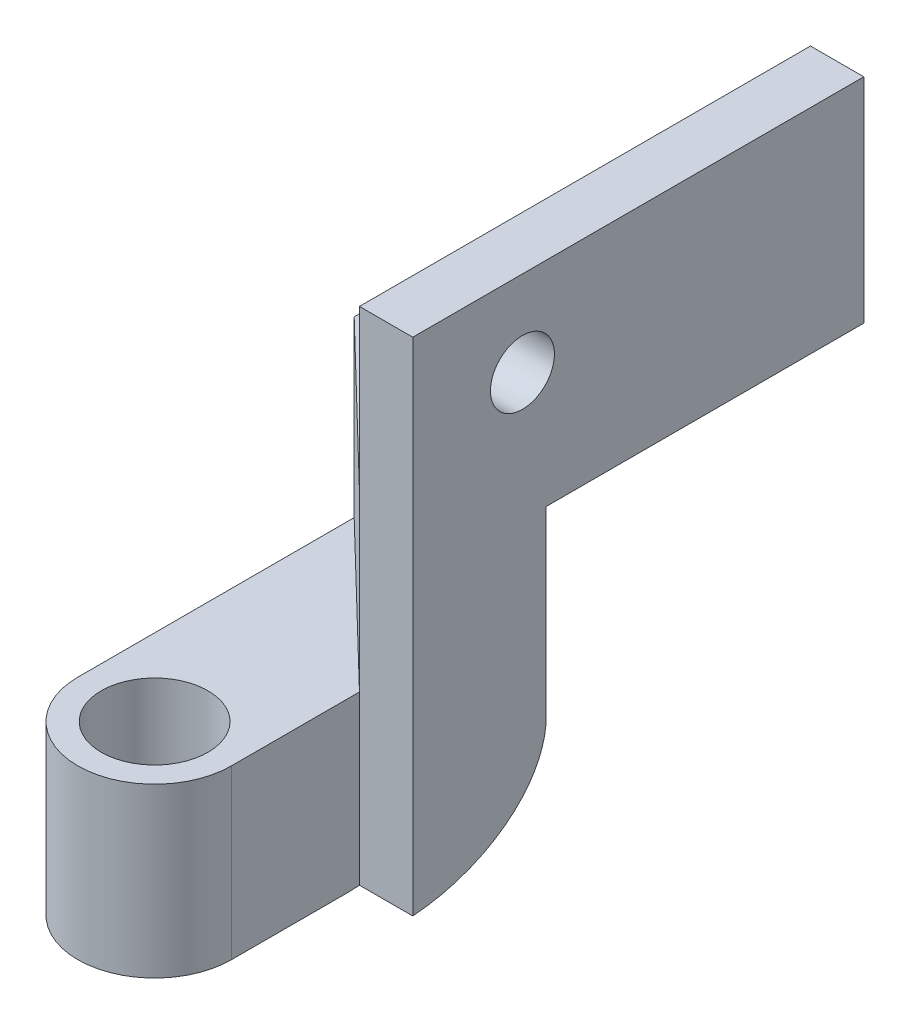
ISO-10303-21;
HEADER;
FILE_DESCRIPTION(('STEP AP214'),'2;1');
FILE_NAME('part.step','',(''),(''),'','','');
FILE_SCHEMA(('AUTOMOTIVE_DESIGN { 1 0 10303 214 1 1 1 1 }'));
ENDSEC;
DATA;
#1=APPLICATION_CONTEXT('core data for automotive mechanical design processes');
#2=APPLICATION_PROTOCOL_DEFINITION('international standard','automotive_design',2000,#1);
#3=PRODUCT_CONTEXT('',#1,'mechanical');
#4=PRODUCT('Part','Part','',(#3));
#5=PRODUCT_RELATED_PRODUCT_CATEGORY('part','',(#4));
#6=PRODUCT_DEFINITION_FORMATION('','',#4);
#7=PRODUCT_DEFINITION_CONTEXT('part definition',#1,'design');
#8=PRODUCT_DEFINITION('design','',#6,#7);
#9=PRODUCT_DEFINITION_SHAPE('','',#8);
#10=(LENGTH_UNIT() NAMED_UNIT(*) SI_UNIT(.MILLI.,.METRE.));
#11=(NAMED_UNIT(*) PLANE_ANGLE_UNIT() SI_UNIT($,.RADIAN.));
#12=(NAMED_UNIT(*) SI_UNIT($,.STERADIAN.) SOLID_ANGLE_UNIT());
#13=UNCERTAINTY_MEASURE_WITH_UNIT(LENGTH_MEASURE(1.E-05),#10,'distance_accuracy_value','');
#14=(GEOMETRIC_REPRESENTATION_CONTEXT(3) GLOBAL_UNCERTAINTY_ASSIGNED_CONTEXT((#13)) GLOBAL_UNIT_ASSIGNED_CONTEXT((#10,
#11,#12)) REPRESENTATION_CONTEXT('',''));
#15=CARTESIAN_POINT('',(0.,0.,0.));
#16=DIRECTION('',(0.,0.,1.));
#17=DIRECTION('',(1.,0.,0.));
#18=AXIS2_PLACEMENT_3D('',#15,#16,#17);
#19=CARTESIAN_POINT('',(3.59999999999999,-2.5,0.));
#20=DIRECTION('',(1.,0.,0.));
#21=DIRECTION('',(0.,0.,-1.));
#22=AXIS2_PLACEMENT_3D('',#19,#20,#21);
#23=PLANE('',#22);
#24=DIRECTION('',(0.,-1.,0.));
#25=VECTOR('',#24,1.);
#26=CARTESIAN_POINT('',(3.60000000000002,0.,-6.));
#27=LINE('',#26,#25);
#28=CARTESIAN_POINT('',(3.59999999999999,-8.15,-6.));
#29=VERTEX_POINT('',#28);
#30=CARTESIAN_POINT('',(3.60000000000002,-15.9949371855331,-6.));
#31=VERTEX_POINT('',#30);
#32=EDGE_CURVE('E166',#29,#31,#27,.T.);
#33=ORIENTED_EDGE('',*,*,#32,.F.);
#34=DIRECTION('',(0.,0.,-1.));
#35=VECTOR('',#34,1.);
#36=CARTESIAN_POINT('',(3.59999999999999,-8.15,0.));
#37=LINE('',#36,#35);
#38=CARTESIAN_POINT('',(3.59999999999999,-8.15,0.));
#39=VERTEX_POINT('',#38);
#40=EDGE_CURVE('E192',#39,#29,#37,.T.);
#41=ORIENTED_EDGE('',*,*,#40,.F.);
#42=DIRECTION('',(0.,1.,0.));
#43=VECTOR('',#42,1.);
#44=CARTESIAN_POINT('',(3.59999999999999,-16.02,0.));
#45=LINE('',#44,#43);
#46=CARTESIAN_POINT('',(3.59999999999999,-16.02,0.));
#47=VERTEX_POINT('',#46);
#48=EDGE_CURVE('E198',#47,#39,#45,.T.);
#49=ORIENTED_EDGE('',*,*,#48,.F.);
#50=DIRECTION('',(0.,0.,1.));
#51=VECTOR('',#50,1.);
#52=CARTESIAN_POINT('',(3.59999999999999,-16.02,0.));
#53=LINE('',#52,#51);
#54=CARTESIAN_POINT('',(3.59999999999999,-16.02,-5.30491820449167));
#55=VERTEX_POINT('',#54);
#56=EDGE_CURVE('E202',#55,#47,#53,.T.);
#57=ORIENTED_EDGE('',*,*,#56,.F.);
#58=CARTESIAN_POINT('',(3.59999999999999,-11.02,-5.30491820449167));
#59=DIRECTION('',(1.,0.,0.));
#60=DIRECTION('',(0.,0.,-1.));
#61=AXIS2_PLACEMENT_3D('',#58,#59,#60);
#62=ELLIPSE('',#61,6.95081795508336,5.);
#63=EDGE_CURVE('E11',#55,#31,#62,.T.);
#64=ORIENTED_EDGE('',*,*,#63,.T.);
#65=EDGE_LOOP('',(#33,#41,#49,#57,#64));
#66=FACE_BOUND('',#65,.T.);
#67=ADVANCED_FACE('F41',(#66),#23,.T.);
#68=CARTESIAN_POINT('',(4.73535338699276,-2.5,-4.9036019787419));
#69=DIRECTION('',(-0.694658370458993,0.,0.719339800338655));
#70=DIRECTION('',(0.719339800338655,0.,0.694658370458993));
#71=AXIS2_PLACEMENT_3D('',#68,#69,#70);
#72=PLANE('',#71);
#73=DIRECTION('',(0.,1.,0.));
#74=VECTOR('',#73,1.);
#75=CARTESIAN_POINT('',(-3.59999999999999,-2.5,-12.9529591786108));
#76=LINE('',#75,#74);
#77=CARTESIAN_POINT('',(-3.59999999999999,-8.15,-12.9529591786108));
#78=VERTEX_POINT('',#77);
#79=CARTESIAN_POINT('',(-3.59999999999999,0.,-12.9529591786108));
#80=VERTEX_POINT('',#79);
#81=EDGE_CURVE('E221',#78,#80,#76,.T.);
#82=ORIENTED_EDGE('',*,*,#81,.F.);
#83=DIRECTION('',(0.719339800338655,0.,0.694658370458993));
#84=VECTOR('',#83,1.);
#85=CARTESIAN_POINT('',(4.73535338699276,-8.15,-4.9036019787419));
#86=LINE('',#85,#84);
#87=EDGE_CURVE('E185',#78,#29,#86,.T.);
#88=ORIENTED_EDGE('',*,*,#87,.T.);
#89=DIRECTION('',(0.,1.,0.));
#90=VECTOR('',#89,1.);
#91=CARTESIAN_POINT('',(3.59999999999999,-2.5,-6.));
#92=LINE('',#91,#90);
#93=CARTESIAN_POINT('',(3.59999999999999,0.,-6.));
#94=VERTEX_POINT('',#93);
#95=EDGE_CURVE('E240',#29,#94,#92,.T.);
#96=ORIENTED_EDGE('',*,*,#95,.T.);
#97=DIRECTION('',(0.719339800338655,0.,0.694658370458993));
#98=VECTOR('',#97,1.);
#99=CARTESIAN_POINT('',(4.73535338699276,0.,-4.9036019787419));
#100=LINE('',#99,#98);
#101=EDGE_CURVE('E223',#80,#94,#100,.T.);
#102=ORIENTED_EDGE('',*,*,#101,.F.);
#103=EDGE_LOOP('',(#82,#88,#96,#102));
#104=FACE_BOUND('',#103,.T.);
#105=ADVANCED_FACE('F277',(#104),#72,.T.);
#106=CARTESIAN_POINT('',(0.,-2.5,0.));
#107=DIRECTION('',(0.,1.,0.));
#108=DIRECTION('',(0.,0.,1.));
#109=AXIS2_PLACEMENT_3D('',#106,#107,#108);
#110=PLANE('',#109);
#111=CARTESIAN_POINT('',(-0.400000000000008,-2.5,-21.14));
#112=DIRECTION('',(0.,1.,0.));
#113=DIRECTION('',(0.,0.,1.));
#114=AXIS2_PLACEMENT_3D('',#111,#112,#113);
#115=CIRCLE('',#114,1.5);
#116=CARTESIAN_POINT('',(-0.400000000000008,-2.5,-19.64));
#117=VERTEX_POINT('',#116);
#118=EDGE_CURVE('E216',#117,#117,#115,.T.);
#119=ORIENTED_EDGE('',*,*,#118,.T.);
#120=EDGE_LOOP('',(#119));
#121=FACE_BOUND('',#120,.T.);
#122=DIRECTION('',(0.719339800338655,0.,0.694658370458993));
#123=VECTOR('',#122,1.);
#124=CARTESIAN_POINT('',(7.86131605405823,-2.5,-8.14063108026585));
#125=LINE('',#124,#123);
#126=CARTESIAN_POINT('',(-2.28622751834374,-2.5,-17.94));
#127=VERTEX_POINT('',#126);
#128=CARTESIAN_POINT('',(3.59999999999999,-2.5,-12.255736159575));
#129=VERTEX_POINT('',#128);
#130=EDGE_CURVE('E245',#127,#129,#125,.T.);
#131=ORIENTED_EDGE('',*,*,#130,.F.);
#132=DIRECTION('',(-1.,0.,0.));
#133=VECTOR('',#132,1.);
#134=CARTESIAN_POINT('',(0.,-2.5,-17.94));
#135=LINE('',#134,#133);
#136=CARTESIAN_POINT('',(-3.59999999999999,-2.5,-17.94));
#137=VERTEX_POINT('',#136);
#138=EDGE_CURVE('E236',#127,#137,#135,.T.);
#139=ORIENTED_EDGE('',*,*,#138,.T.);
#140=DIRECTION('',(0.,0.,1.));
#141=VECTOR('',#140,1.);
#142=CARTESIAN_POINT('',(-3.59999999999999,-2.5,0.));
#143=LINE('',#142,#141);
#144=CARTESIAN_POINT('',(-3.6,-2.5,-27.14));
#145=VERTEX_POINT('',#144);
#146=EDGE_CURVE('E212',#145,#137,#143,.T.);
#147=ORIENTED_EDGE('',*,*,#146,.F.);
#148=DIRECTION('',(-1.,0.,0.));
#149=VECTOR('',#148,1.);
#150=CARTESIAN_POINT('',(0.,-2.5,-27.14));
#151=LINE('',#150,#149);
#152=CARTESIAN_POINT('',(6.10000000000014,-2.5,-27.14));
#153=VERTEX_POINT('',#152);
#154=EDGE_CURVE('E211',#153,#145,#151,.T.);
#155=ORIENTED_EDGE('',*,*,#154,.F.);
#156=DIRECTION('',(0.,0.,-1.));
#157=VECTOR('',#156,1.);
#158=CARTESIAN_POINT('',(6.09999999999999,-2.5,0.));
#159=LINE('',#158,#157);
#160=CARTESIAN_POINT('',(6.10000000000006,-2.5,-12.255736159575));
#161=VERTEX_POINT('',#160);
#162=EDGE_CURVE('E315',#161,#153,#159,.T.);
#163=ORIENTED_EDGE('',*,*,#162,.F.);
#164=DIRECTION('',(-1.,0.,0.));
#165=VECTOR('',#164,1.);
#166=CARTESIAN_POINT('',(6.10000000000006,-2.5,-12.255736159575));
#167=LINE('',#166,#165);
#168=EDGE_CURVE('E172',#161,#129,#167,.T.);
#169=ORIENTED_EDGE('',*,*,#168,.T.);
#170=EDGE_LOOP('',(#131,#139,#147,#155,#163,#169));
#171=FACE_BOUND('',#170,.T.);
#172=ADVANCED_FACE('F309',(#121,#171),#110,.F.);
#173=CARTESIAN_POINT('',(-3.59999999999999,-2.5,0.));
#174=DIRECTION('',(-1.,0.,0.));
#175=DIRECTION('',(0.,0.,1.));
#176=AXIS2_PLACEMENT_3D('',#173,#174,#175);
#177=PLANE('',#176);
#178=DIRECTION('',(0.,1.,0.));
#179=VECTOR('',#178,1.);
#180=CARTESIAN_POINT('',(-3.59999999999999,-29.9628691451939,-17.94));
#181=LINE('',#180,#179);
#182=CARTESIAN_POINT('',(-3.59999999999999,-13.899817646817,-17.94));
#183=VERTEX_POINT('',#182);
#184=EDGE_CURVE('E206',#183,#137,#181,.T.);
#185=ORIENTED_EDGE('',*,*,#184,.F.);
#186=CARTESIAN_POINT('',(-3.59999999999999,-11.02,-12.2578773831025));
#187=DIRECTION('',(-1.,0.,0.));
#188=DIRECTION('',(0.,0.,-1.));
#189=AXIS2_PLACEMENT_3D('',#186,#187,#188);
#190=ELLIPSE('',#189,6.95081795508336,5.);
#191=CARTESIAN_POINT('',(-3.59999999999999,-16.02,-12.2578773831025));
#192=VERTEX_POINT('',#191);
#193=EDGE_CURVE('E64',#183,#192,#190,.T.);
#194=ORIENTED_EDGE('',*,*,#193,.T.);
#195=DIRECTION('',(0.,0.,-1.));
#196=VECTOR('',#195,1.);
#197=CARTESIAN_POINT('',(-3.59999999999999,-16.02,0.));
#198=LINE('',#197,#196);
#199=CARTESIAN_POINT('',(-3.59999999999999,-16.02,0.));
#200=VERTEX_POINT('',#199);
#201=EDGE_CURVE('E197',#200,#192,#198,.T.);
#202=ORIENTED_EDGE('',*,*,#201,.F.);
#203=DIRECTION('',(0.,1.,0.));
#204=VECTOR('',#203,1.);
#205=CARTESIAN_POINT('',(-3.59999999999999,-16.02,0.));
#206=LINE('',#205,#204);
#207=CARTESIAN_POINT('',(-3.59999999999999,-8.15,0.));
#208=VERTEX_POINT('',#207);
#209=EDGE_CURVE('E183',#200,#208,#206,.T.);
#210=ORIENTED_EDGE('',*,*,#209,.T.);
#211=DIRECTION('',(0.,0.,1.));
#212=VECTOR('',#211,1.);
#213=CARTESIAN_POINT('',(-3.59999999999999,-8.15,0.));
#214=LINE('',#213,#212);
#215=EDGE_CURVE('E175',#78,#208,#214,.T.);
#216=ORIENTED_EDGE('',*,*,#215,.F.);
#217=ORIENTED_EDGE('',*,*,#81,.T.);
#218=DIRECTION('',(0.,0.,1.));
#219=VECTOR('',#218,1.);
#220=CARTESIAN_POINT('',(-3.59999999999999,0.,0.));
#221=LINE('',#220,#219);
#222=CARTESIAN_POINT('',(-3.6,0.,-27.14));
#223=VERTEX_POINT('',#222);
#224=EDGE_CURVE('E205',#223,#80,#221,.T.);
#225=ORIENTED_EDGE('',*,*,#224,.F.);
#226=DIRECTION('',(0.,1.,0.));
#227=VECTOR('',#226,1.);
#228=CARTESIAN_POINT('',(-3.6,-2.5,-27.14));
#229=LINE('',#228,#227);
#230=EDGE_CURVE('E234',#145,#223,#229,.T.);
#231=ORIENTED_EDGE('',*,*,#230,.F.);
#232=ORIENTED_EDGE('',*,*,#146,.T.);
#233=EDGE_LOOP('',(#185,#194,#202,#210,#216,#217,#225,#231,#232));
#234=FACE_BOUND('',#233,.T.);
#235=ADVANCED_FACE('F253',(#234),#177,.T.);
#236=CARTESIAN_POINT('',(0.,-2.5,-27.14));
#237=DIRECTION('',(0.,0.,-1.));
#238=DIRECTION('',(-1.,0.,0.));
#239=AXIS2_PLACEMENT_3D('',#236,#237,#238);
#240=PLANE('',#239);
#241=DIRECTION('',(-1.,0.,0.));
#242=VECTOR('',#241,1.);
#243=CARTESIAN_POINT('',(0.,0.,-27.14));
#244=LINE('',#243,#242);
#245=CARTESIAN_POINT('',(3.59999999999999,0.,-27.14));
#246=VERTEX_POINT('',#245);
#247=EDGE_CURVE('E230',#246,#223,#244,.T.);
#248=ORIENTED_EDGE('',*,*,#247,.F.);
#249=DIRECTION('',(0.,1.,0.));
#250=VECTOR('',#249,1.);
#251=CARTESIAN_POINT('',(3.60000000000014,0.,-27.14));
#252=LINE('',#251,#250);
#253=CARTESIAN_POINT('',(3.60000000000014,7.5,-27.14));
#254=VERTEX_POINT('',#253);
#255=EDGE_CURVE('E288',#246,#254,#252,.T.);
#256=ORIENTED_EDGE('',*,*,#255,.T.);
#257=DIRECTION('',(-1.,0.,0.));
#258=VECTOR('',#257,1.);
#259=CARTESIAN_POINT('',(6.10000000000014,7.5,-27.14));
#260=LINE('',#259,#258);
#261=CARTESIAN_POINT('',(6.10000000000014,7.5,-27.14));
#262=VERTEX_POINT('',#261);
#263=EDGE_CURVE('E303',#262,#254,#260,.T.);
#264=ORIENTED_EDGE('',*,*,#263,.F.);
#265=DIRECTION('',(0.,1.,0.));
#266=VECTOR('',#265,1.);
#267=CARTESIAN_POINT('',(6.10000000000014,0.,-27.14));
#268=LINE('',#267,#266);
#269=EDGE_CURVE('E322',#153,#262,#268,.T.);
#270=ORIENTED_EDGE('',*,*,#269,.F.);
#271=ORIENTED_EDGE('',*,*,#154,.T.);
#272=ORIENTED_EDGE('',*,*,#230,.T.);
#273=EDGE_LOOP('',(#248,#256,#264,#270,#271,#272));
#274=FACE_BOUND('',#273,.T.);
#275=ADVANCED_FACE('F316',(#274),#240,.T.);
#276=CARTESIAN_POINT('',(-0.400000000000008,-2.5,-21.14));
#277=DIRECTION('',(0.,1.,0.));
#278=DIRECTION('',(0.,0.,1.));
#279=AXIS2_PLACEMENT_3D('',#276,#277,#278);
#280=CYLINDRICAL_SURFACE('',#279,1.5);
#281=ORIENTED_EDGE('',*,*,#118,.F.);
#282=EDGE_LOOP('',(#281));
#283=FACE_BOUND('',#282,.T.);
#284=CARTESIAN_POINT('',(-0.400000000000008,0.,-21.14));
#285=DIRECTION('',(0.,1.,0.));
#286=DIRECTION('',(0.,0.,1.));
#287=AXIS2_PLACEMENT_3D('',#284,#285,#286);
#288=CIRCLE('',#287,1.5);
#289=CARTESIAN_POINT('',(-0.400000000000008,0.,-19.64));
#290=VERTEX_POINT('',#289);
#291=EDGE_CURVE('E213',#290,#290,#288,.T.);
#292=ORIENTED_EDGE('',*,*,#291,.T.);
#293=EDGE_LOOP('',(#292));
#294=FACE_BOUND('',#293,.T.);
#295=ADVANCED_FACE('F353',(#283,#294),#280,.F.);
#296=CARTESIAN_POINT('',(0.,0.,0.));
#297=DIRECTION('',(0.,1.,0.));
#298=DIRECTION('',(0.,0.,1.));
#299=AXIS2_PLACEMENT_3D('',#296,#297,#298);
#300=PLANE('',#299);
#301=DIRECTION('',(0.,0.,-1.));
#302=VECTOR('',#301,1.);
#303=CARTESIAN_POINT('',(3.59999999999999,0.,0.));
#304=LINE('',#303,#302);
#305=EDGE_CURVE('E227',#94,#246,#304,.T.);
#306=ORIENTED_EDGE('',*,*,#305,.T.);
#307=ORIENTED_EDGE('',*,*,#247,.T.);
#308=ORIENTED_EDGE('',*,*,#224,.T.);
#309=ORIENTED_EDGE('',*,*,#101,.T.);
#310=EDGE_LOOP('',(#306,#307,#308,#309));
#311=FACE_BOUND('',#310,.T.);
#312=ORIENTED_EDGE('',*,*,#291,.F.);
#313=EDGE_LOOP('',(#312));
#314=FACE_BOUND('',#313,.T.);
#315=ADVANCED_FACE('F276',(#311,#314),#300,.T.);
#316=CARTESIAN_POINT('',(7.86131605405823,-29.9628691451939,-8.14063108026585));
#317=DIRECTION('',(-0.694658370458993,0.,0.719339800338655));
#318=DIRECTION('',(0.719339800338655,0.,0.694658370458993));
#319=AXIS2_PLACEMENT_3D('',#316,#317,#318);
#320=PLANE('',#319);
#321=DIRECTION('',(0.,1.,0.));
#322=VECTOR('',#321,1.);
#323=CARTESIAN_POINT('',(3.59999999999999,-29.9628691451939,-12.255736159575));
#324=LINE('',#323,#322);
#325=CARTESIAN_POINT('',(3.59999999999999,-11.02,-12.255736159575));
#326=VERTEX_POINT('',#325);
#327=EDGE_CURVE('E204',#326,#129,#324,.T.);
#328=ORIENTED_EDGE('',*,*,#327,.F.);
#329=DIRECTION('',(-0.719339800338655,0.,-0.694658370458993));
#330=VECTOR('',#329,1.);
#331=CARTESIAN_POINT('',(7.86131605405823,-11.02,-8.14063108026585));
#332=LINE('',#331,#330);
#333=CARTESIAN_POINT('',(-2.28622751834374,-11.02,-17.94));
#334=VERTEX_POINT('',#333);
#335=EDGE_CURVE('E242',#326,#334,#332,.T.);
#336=ORIENTED_EDGE('',*,*,#335,.T.);
#337=DIRECTION('',(0.,1.,0.));
#338=VECTOR('',#337,1.);
#339=CARTESIAN_POINT('',(-2.28622751834374,-29.9628691451939,-17.94));
#340=LINE('',#339,#338);
#341=EDGE_CURVE('E196',#334,#127,#340,.T.);
#342=ORIENTED_EDGE('',*,*,#341,.T.);
#343=ORIENTED_EDGE('',*,*,#130,.T.);
#344=EDGE_LOOP('',(#328,#336,#342,#343));
#345=FACE_BOUND('',#344,.T.);
#346=ADVANCED_FACE('F317',(#345),#320,.F.);
#347=CARTESIAN_POINT('',(0.,-29.9628691451939,-17.94));
#348=DIRECTION('',(0.,0.,-1.));
#349=DIRECTION('',(-1.,0.,0.));
#350=AXIS2_PLACEMENT_3D('',#347,#348,#349);
#351=PLANE('',#350);
#352=ORIENTED_EDGE('',*,*,#341,.F.);
#353=CARTESIAN_POINT('',(-9.48401021647241,-11.02,-17.94));
#354=DIRECTION('',(0.,0.,-1.));
#355=DIRECTION('',(-1.,0.,0.));
#356=AXIS2_PLACEMENT_3D('',#353,#354,#355);
#357=ELLIPSE('',#356,7.19778269812867,5.);
#358=EDGE_CURVE('E250',#334,#183,#357,.T.);
#359=ORIENTED_EDGE('',*,*,#358,.T.);
#360=ORIENTED_EDGE('',*,*,#184,.T.);
#361=ORIENTED_EDGE('',*,*,#138,.F.);
#362=EDGE_LOOP('',(#352,#359,#360,#361));
#363=FACE_BOUND('',#362,.T.);
#364=ADVANCED_FACE('F252',(#363),#351,.T.);
#365=CARTESIAN_POINT('',(0.,-16.02,0.));
#366=DIRECTION('',(0.,1.,0.));
#367=DIRECTION('',(0.,0.,1.));
#368=AXIS2_PLACEMENT_3D('',#365,#366,#367);
#369=PLANE('',#368);
#370=ORIENTED_EDGE('',*,*,#201,.T.);
#371=DIRECTION('',(-0.719339800338655,0.,-0.694658370458993));
#372=VECTOR('',#371,1.);
#373=CARTESIAN_POINT('',(4.38802420176326,-16.02,-4.54393207857258));
#374=LINE('',#373,#372);
#375=EDGE_CURVE('E47',#192,#55,#374,.F.);
#376=ORIENTED_EDGE('',*,*,#375,.T.);
#377=ORIENTED_EDGE('',*,*,#56,.T.);
#378=CARTESIAN_POINT('',(0.,-16.02,0.));
#379=DIRECTION('',(0.,1.,0.));
#380=DIRECTION('',(0.,0.,1.));
#381=AXIS2_PLACEMENT_3D('',#378,#379,#380);
#382=CIRCLE('',#381,3.59999999999999);
#383=EDGE_CURVE('E181',#200,#47,#382,.T.);
#384=ORIENTED_EDGE('',*,*,#383,.F.);
#385=EDGE_LOOP('',(#370,#376,#377,#384));
#386=FACE_BOUND('',#385,.T.);
#387=CARTESIAN_POINT('',(0.,-16.02,0.));
#388=DIRECTION('',(0.,1.,0.));
#389=DIRECTION('',(0.,0.,1.));
#390=AXIS2_PLACEMENT_3D('',#387,#388,#389);
#391=CIRCLE('',#390,2.5);
#392=CARTESIAN_POINT('',(0.,-16.02,2.5));
#393=VERTEX_POINT('',#392);
#394=EDGE_CURVE('E178',#393,#393,#391,.T.);
#395=ORIENTED_EDGE('',*,*,#394,.T.);
#396=EDGE_LOOP('',(#395));
#397=FACE_BOUND('',#396,.T.);
#398=ADVANCED_FACE('F264',(#386,#397),#369,.F.);
#399=CARTESIAN_POINT('',(0.,-16.02,0.));
#400=DIRECTION('',(0.,1.,0.));
#401=DIRECTION('',(0.,0.,1.));
#402=AXIS2_PLACEMENT_3D('',#399,#400,#401);
#403=CYLINDRICAL_SURFACE('',#402,2.5);
#404=ORIENTED_EDGE('',*,*,#394,.F.);
#405=EDGE_LOOP('',(#404));
#406=FACE_BOUND('',#405,.T.);
#407=CARTESIAN_POINT('',(0.,-8.15,0.));
#408=DIRECTION('',(0.,1.,0.));
#409=DIRECTION('',(0.,0.,1.));
#410=AXIS2_PLACEMENT_3D('',#407,#408,#409);
#411=CIRCLE('',#410,2.5);
#412=CARTESIAN_POINT('',(0.,-8.15,2.5));
#413=VERTEX_POINT('',#412);
#414=EDGE_CURVE('E169',#413,#413,#411,.T.);
#415=ORIENTED_EDGE('',*,*,#414,.T.);
#416=EDGE_LOOP('',(#415));
#417=FACE_BOUND('',#416,.T.);
#418=ADVANCED_FACE('F339',(#406,#417),#403,.F.);
#419=CARTESIAN_POINT('',(0.,-16.02,0.));
#420=DIRECTION('',(0.,1.,0.));
#421=DIRECTION('',(0.,0.,1.));
#422=AXIS2_PLACEMENT_3D('',#419,#420,#421);
#423=CYLINDRICAL_SURFACE('',#422,3.59999999999999);
#424=CARTESIAN_POINT('',(0.,-8.15,0.));
#425=DIRECTION('',(0.,1.,0.));
#426=DIRECTION('',(0.,0.,1.));
#427=AXIS2_PLACEMENT_3D('',#424,#425,#426);
#428=CIRCLE('',#427,3.59999999999999);
#429=EDGE_CURVE('E189',#208,#39,#428,.T.);
#430=ORIENTED_EDGE('',*,*,#429,.F.);
#431=ORIENTED_EDGE('',*,*,#209,.F.);
#432=ORIENTED_EDGE('',*,*,#383,.T.);
#433=ORIENTED_EDGE('',*,*,#48,.T.);
#434=EDGE_LOOP('',(#430,#431,#432,#433));
#435=FACE_BOUND('',#434,.T.);
#436=ADVANCED_FACE('F268',(#435),#423,.T.);
#437=CARTESIAN_POINT('',(0.,-8.15,0.));
#438=DIRECTION('',(0.,1.,0.));
#439=DIRECTION('',(0.,0.,1.));
#440=AXIS2_PLACEMENT_3D('',#437,#438,#439);
#441=PLANE('',#440);
#442=ORIENTED_EDGE('',*,*,#414,.F.);
#443=EDGE_LOOP('',(#442));
#444=FACE_BOUND('',#443,.T.);
#445=ORIENTED_EDGE('',*,*,#215,.T.);
#446=ORIENTED_EDGE('',*,*,#429,.T.);
#447=ORIENTED_EDGE('',*,*,#40,.T.);
#448=ORIENTED_EDGE('',*,*,#87,.F.);
#449=EDGE_LOOP('',(#445,#446,#447,#448));
#450=FACE_BOUND('',#449,.T.);
#451=ADVANCED_FACE('F334',(#444,#450),#441,.T.);
#452=CARTESIAN_POINT('',(4.38802420176326,-11.02,-4.54393207857258));
#453=DIRECTION('',(-0.719339800338655,0.,-0.694658370458993));
#454=DIRECTION('',(-0.694658370458993,0.,0.719339800338655));
#455=AXIS2_PLACEMENT_3D('',#452,#453,#454);
#456=CYLINDRICAL_SURFACE('',#455,5.);
#457=ORIENTED_EDGE('',*,*,#63,.F.);
#458=ORIENTED_EDGE('',*,*,#375,.F.);
#459=ORIENTED_EDGE('',*,*,#193,.F.);
#460=ORIENTED_EDGE('',*,*,#358,.F.);
#461=ORIENTED_EDGE('',*,*,#335,.F.);
#462=CARTESIAN_POINT('',(3.60000000000002,-11.02,-5.30491820449167));
#463=DIRECTION('',(1.,0.,0.));
#464=DIRECTION('',(0.,0.,-1.));
#465=AXIS2_PLACEMENT_3D('',#462,#463,#464);
#466=ELLIPSE('',#465,6.95081795508336,5.);
#467=EDGE_CURVE('E256',#31,#326,#466,.T.);
#468=ORIENTED_EDGE('',*,*,#467,.F.);
#469=EDGE_LOOP('',(#457,#458,#459,#460,#461,#468));
#470=FACE_BOUND('',#469,.T.);
#471=ADVANCED_FACE('F43',(#470),#456,.T.);
#472=CARTESIAN_POINT('',(6.10000000000002,0.,-5.99999999999999));
#473=DIRECTION('',(0.,0.,-1.));
#474=DIRECTION('',(-1.,0.,0.));
#475=AXIS2_PLACEMENT_3D('',#472,#473,#474);
#476=PLANE('',#475);
#477=CARTESIAN_POINT('',(3.60000000000002,7.5,-5.99999999999999));
#478=VERTEX_POINT('',#477);
#479=EDGE_CURVE('E289',#478,#94,#27,.T.);
#480=ORIENTED_EDGE('',*,*,#479,.T.);
#481=ORIENTED_EDGE('',*,*,#95,.F.);
#482=ORIENTED_EDGE('',*,*,#32,.T.);
#483=DIRECTION('',(-1.,0.,0.));
#484=VECTOR('',#483,1.);
#485=CARTESIAN_POINT('',(6.10000000000002,-15.9949371855331,-5.99999999999999));
#486=LINE('',#485,#484);
#487=CARTESIAN_POINT('',(6.10000000000002,-15.9949371855331,-5.99999999999999));
#488=VERTEX_POINT('',#487);
#489=EDGE_CURVE('E147',#488,#31,#486,.T.);
#490=ORIENTED_EDGE('',*,*,#489,.F.);
#491=DIRECTION('',(0.,-1.,0.));
#492=VECTOR('',#491,1.);
#493=CARTESIAN_POINT('',(6.10000000000002,0.,-5.99999999999999));
#494=LINE('',#493,#492);
#495=CARTESIAN_POINT('',(6.10000000000002,7.5,-5.99999999999998));
#496=VERTEX_POINT('',#495);
#497=EDGE_CURVE('E155',#496,#488,#494,.T.);
#498=ORIENTED_EDGE('',*,*,#497,.F.);
#499=DIRECTION('',(-1.,0.,0.));
#500=VECTOR('',#499,1.);
#501=CARTESIAN_POINT('',(6.10000000000002,7.5,-5.99999999999998));
#502=LINE('',#501,#500);
#503=EDGE_CURVE('E290',#496,#478,#502,.T.);
#504=ORIENTED_EDGE('',*,*,#503,.T.);
#505=EDGE_LOOP('',(#480,#481,#482,#490,#498,#504));
#506=FACE_BOUND('',#505,.T.);
#507=ADVANCED_FACE('F168',(#506),#476,.F.);
#508=CARTESIAN_POINT('',(6.10000000000002,-11.02,-5.30491820449165));
#509=DIRECTION('',(1.,0.,0.));
#510=DIRECTION('',(0.,0.,-1.));
#511=AXIS2_PLACEMENT_3D('',#508,#509,#510);
#512=ELLIPSE('',#511,6.95081795508336,5.);
#513=DIRECTION('',(-1.,0.,0.));
#514=VECTOR('',#513,1.);
#515=SURFACE_OF_LINEAR_EXTRUSION('',#512,#514);
#516=ORIENTED_EDGE('',*,*,#467,.T.);
#517=DIRECTION('',(-1.,0.,0.));
#518=VECTOR('',#517,1.);
#519=CARTESIAN_POINT('',(6.10000000000006,-11.02,-12.255736159575));
#520=LINE('',#519,#518);
#521=CARTESIAN_POINT('',(6.10000000000006,-11.02,-12.255736159575));
#522=VERTEX_POINT('',#521);
#523=EDGE_CURVE('E149',#522,#326,#520,.T.);
#524=ORIENTED_EDGE('',*,*,#523,.F.);
#525=EDGE_CURVE('E142',#488,#522,#512,.T.);
#526=ORIENTED_EDGE('',*,*,#525,.F.);
#527=ORIENTED_EDGE('',*,*,#489,.T.);
#528=EDGE_LOOP('',(#516,#524,#526,#527));
#529=FACE_BOUND('',#528,.T.);
#530=ADVANCED_FACE('F144',(#529),#515,.F.);
#531=CARTESIAN_POINT('',(6.10000000000006,0.,-12.255736159575));
#532=DIRECTION('',(0.,0.,1.));
#533=DIRECTION('',(1.,0.,0.));
#534=AXIS2_PLACEMENT_3D('',#531,#532,#533);
#535=PLANE('',#534);
#536=ORIENTED_EDGE('',*,*,#327,.T.);
#537=ORIENTED_EDGE('',*,*,#168,.F.);
#538=DIRECTION('',(0.,1.,0.));
#539=VECTOR('',#538,1.);
#540=CARTESIAN_POINT('',(6.10000000000006,0.,-12.255736159575));
#541=LINE('',#540,#539);
#542=EDGE_CURVE('E153',#522,#161,#541,.T.);
#543=ORIENTED_EDGE('',*,*,#542,.F.);
#544=ORIENTED_EDGE('',*,*,#523,.T.);
#545=EDGE_LOOP('',(#536,#537,#543,#544));
#546=FACE_BOUND('',#545,.T.);
#547=ADVANCED_FACE('F313',(#546),#535,.F.);
#548=CARTESIAN_POINT('',(6.09999999999999,7.5,0.));
#549=DIRECTION('',(0.,-1.,0.));
#550=DIRECTION('',(0.,0.,-1.));
#551=AXIS2_PLACEMENT_3D('',#548,#549,#550);
#552=PLANE('',#551);
#553=DIRECTION('',(0.,0.,1.));
#554=VECTOR('',#553,1.);
#555=CARTESIAN_POINT('',(3.59999999999999,7.5,0.));
#556=LINE('',#555,#554);
#557=EDGE_CURVE('E296',#254,#478,#556,.T.);
#558=ORIENTED_EDGE('',*,*,#557,.T.);
#559=ORIENTED_EDGE('',*,*,#503,.F.);
#560=DIRECTION('',(0.,0.,1.));
#561=VECTOR('',#560,1.);
#562=CARTESIAN_POINT('',(6.09999999999999,7.5,0.));
#563=LINE('',#562,#561);
#564=EDGE_CURVE('E159',#262,#496,#563,.T.);
#565=ORIENTED_EDGE('',*,*,#564,.F.);
#566=ORIENTED_EDGE('',*,*,#263,.T.);
#567=EDGE_LOOP('',(#558,#559,#565,#566));
#568=FACE_BOUND('',#567,.T.);
#569=ADVANCED_FACE('F439',(#568),#552,.F.);
#570=CARTESIAN_POINT('',(6.10000000000005,3.5,-11.14));
#571=DIRECTION('',(-1.,0.,0.));
#572=DIRECTION('',(0.,0.,1.));
#573=AXIS2_PLACEMENT_3D('',#570,#571,#572);
#574=CYLINDRICAL_SURFACE('',#573,1.5);
#575=CARTESIAN_POINT('',(6.10000000000005,3.5,-11.14));
#576=DIRECTION('',(1.,0.,0.));
#577=DIRECTION('',(0.,0.,-1.));
#578=AXIS2_PLACEMENT_3D('',#575,#576,#577);
#579=CIRCLE('',#578,1.5);
#580=CARTESIAN_POINT('',(6.10000000000006,3.5,-12.64));
#581=VERTEX_POINT('',#580);
#582=EDGE_CURVE('E295',#581,#581,#579,.T.);
#583=ORIENTED_EDGE('',*,*,#582,.T.);
#584=EDGE_LOOP('',(#583));
#585=FACE_BOUND('',#584,.T.);
#586=CARTESIAN_POINT('',(3.60000000000005,3.5,-11.14));
#587=DIRECTION('',(1.,0.,0.));
#588=DIRECTION('',(0.,0.,-1.));
#589=AXIS2_PLACEMENT_3D('',#586,#587,#588);
#590=CIRCLE('',#589,1.5);
#591=CARTESIAN_POINT('',(3.60000000000006,3.5,-12.64));
#592=VERTEX_POINT('',#591);
#593=EDGE_CURVE('E162',#592,#592,#590,.T.);
#594=ORIENTED_EDGE('',*,*,#593,.F.);
#595=EDGE_LOOP('',(#594));
#596=FACE_BOUND('',#595,.T.);
#597=ADVANCED_FACE('F447',(#585,#596),#574,.F.);
#598=CARTESIAN_POINT('',(6.09999999999999,0.,0.));
#599=DIRECTION('',(1.,0.,0.));
#600=DIRECTION('',(0.,0.,-1.));
#601=AXIS2_PLACEMENT_3D('',#598,#599,#600);
#602=PLANE('',#601);
#603=ORIENTED_EDGE('',*,*,#497,.T.);
#604=ORIENTED_EDGE('',*,*,#525,.T.);
#605=ORIENTED_EDGE('',*,*,#542,.T.);
#606=ORIENTED_EDGE('',*,*,#162,.T.);
#607=ORIENTED_EDGE('',*,*,#269,.T.);
#608=ORIENTED_EDGE('',*,*,#564,.T.);
#609=EDGE_LOOP('',(#603,#604,#605,#606,#607,#608));
#610=FACE_BOUND('',#609,.T.);
#611=ORIENTED_EDGE('',*,*,#582,.F.);
#612=EDGE_LOOP('',(#611));
#613=FACE_BOUND('',#612,.T.);
#614=ADVANCED_FACE('F152',(#610,#613),#602,.T.);
#615=CARTESIAN_POINT('',(3.59999999999999,0.,0.));
#616=DIRECTION('',(1.,0.,0.));
#617=DIRECTION('',(0.,0.,-1.));
#618=AXIS2_PLACEMENT_3D('',#615,#616,#617);
#619=PLANE('',#618);
#620=ORIENTED_EDGE('',*,*,#305,.F.);
#621=ORIENTED_EDGE('',*,*,#479,.F.);
#622=ORIENTED_EDGE('',*,*,#557,.F.);
#623=ORIENTED_EDGE('',*,*,#255,.F.);
#624=EDGE_LOOP('',(#620,#621,#622,#623));
#625=FACE_BOUND('',#624,.T.);
#626=ORIENTED_EDGE('',*,*,#593,.T.);
#627=EDGE_LOOP('',(#626));
#628=FACE_BOUND('',#627,.T.);
#629=ADVANCED_FACE('F282',(#625,#628),#619,.F.);
#630=CLOSED_SHELL('',(#67,#105,#172,#235,#275,#295,#315,#346,#364,#398,#418,#436,#451,#471,#507,
#530,#547,#569,#597,#614,#629));
#631=MANIFOLD_SOLID_BREP('B2',#630);
#632=ADVANCED_BREP_SHAPE_REPRESENTATION('',(#18,#631),#14);
#633=SHAPE_DEFINITION_REPRESENTATION(#9,#632);
ENDSEC;
END-ISO-10303-21;
